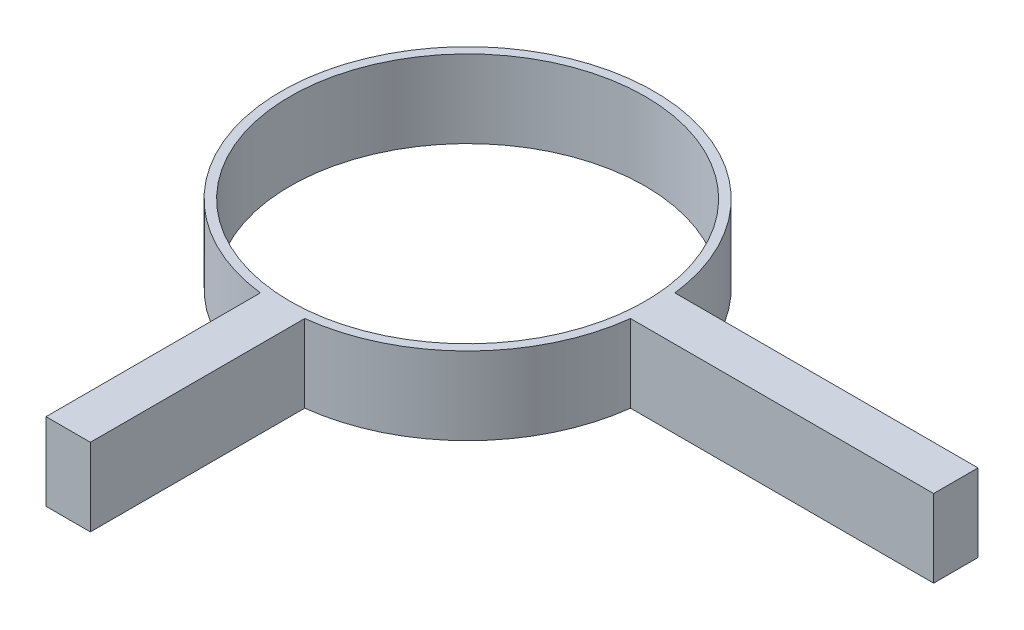
ISO-10303-21;
HEADER;
FILE_DESCRIPTION(('STEP AP214'),'2;1');
FILE_NAME('part.step','',(''),(''),'','','');
FILE_SCHEMA(('AUTOMOTIVE_DESIGN { 1 0 10303 214 1 1 1 1 }'));
ENDSEC;
DATA;
#1=APPLICATION_CONTEXT('core data for automotive mechanical design processes');
#2=APPLICATION_PROTOCOL_DEFINITION('international standard','automotive_design',2000,#1);
#3=PRODUCT_CONTEXT('',#1,'mechanical');
#4=PRODUCT('Part','Part','',(#3));
#5=PRODUCT_RELATED_PRODUCT_CATEGORY('part','',(#4));
#6=PRODUCT_DEFINITION_FORMATION('','',#4);
#7=PRODUCT_DEFINITION_CONTEXT('part definition',#1,'design');
#8=PRODUCT_DEFINITION('design','',#6,#7);
#9=PRODUCT_DEFINITION_SHAPE('','',#8);
#10=(LENGTH_UNIT() NAMED_UNIT(*) SI_UNIT(.MILLI.,.METRE.));
#11=(NAMED_UNIT(*) PLANE_ANGLE_UNIT() SI_UNIT($,.RADIAN.));
#12=(NAMED_UNIT(*) SI_UNIT($,.STERADIAN.) SOLID_ANGLE_UNIT());
#13=UNCERTAINTY_MEASURE_WITH_UNIT(LENGTH_MEASURE(1.E-05),#10,'distance_accuracy_value','');
#14=(GEOMETRIC_REPRESENTATION_CONTEXT(3) GLOBAL_UNCERTAINTY_ASSIGNED_CONTEXT((#13)) GLOBAL_UNIT_ASSIGNED_CONTEXT((#10,
#11,#12)) REPRESENTATION_CONTEXT('',''));
#15=CARTESIAN_POINT('',(0.,0.,0.));
#16=DIRECTION('',(0.,0.,1.));
#17=DIRECTION('',(1.,0.,0.));
#18=AXIS2_PLACEMENT_3D('',#15,#16,#17);
#19=CARTESIAN_POINT('',(0.,7.,0.));
#20=DIRECTION('',(0.,-1.,0.));
#21=DIRECTION('',(0.,0.,-1.));
#22=AXIS2_PLACEMENT_3D('',#19,#20,#21);
#23=CYLINDRICAL_SURFACE('',#22,16.8);
#24=CARTESIAN_POINT('',(0.,0.,0.));
#25=DIRECTION('',(0.,1.,0.));
#26=DIRECTION('',(0.,0.,1.));
#27=AXIS2_PLACEMENT_3D('',#24,#25,#26);
#28=CIRCLE('',#27,16.8);
#29=CARTESIAN_POINT('',(2.,0.,16.6805275695944));
#30=VERTEX_POINT('',#29);
#31=CARTESIAN_POINT('',(16.6805275695944,0.,2.));
#32=VERTEX_POINT('',#31);
#33=EDGE_CURVE('E143',#30,#32,#28,.T.);
#34=ORIENTED_EDGE('',*,*,#33,.T.);
#35=DIRECTION('',(0.,-1.,0.));
#36=VECTOR('',#35,1.);
#37=CARTESIAN_POINT('',(16.6805275695944,7.,2.));
#38=LINE('',#37,#36);
#39=CARTESIAN_POINT('',(16.6805275695944,7.,2.));
#40=VERTEX_POINT('',#39);
#41=EDGE_CURVE('E11',#40,#32,#38,.T.);
#42=ORIENTED_EDGE('',*,*,#41,.F.);
#43=CARTESIAN_POINT('',(0.,7.,0.));
#44=DIRECTION('',(0.,1.,0.));
#45=DIRECTION('',(0.,0.,1.));
#46=AXIS2_PLACEMENT_3D('',#43,#44,#45);
#47=CIRCLE('',#46,16.8);
#48=CARTESIAN_POINT('',(2.,7.,16.6805275695944));
#49=VERTEX_POINT('',#48);
#50=EDGE_CURVE('E100',#49,#40,#47,.T.);
#51=ORIENTED_EDGE('',*,*,#50,.F.);
#52=DIRECTION('',(0.,-1.,0.));
#53=VECTOR('',#52,1.);
#54=CARTESIAN_POINT('',(2.,7.,16.6805275695944));
#55=LINE('',#54,#53);
#56=EDGE_CURVE('E136',#49,#30,#55,.T.);
#57=ORIENTED_EDGE('',*,*,#56,.T.);
#58=EDGE_LOOP('',(#34,#42,#51,#57));
#59=FACE_BOUND('',#58,.T.);
#60=ADVANCED_FACE('F43',(#59),#23,.T.);
#61=CARTESIAN_POINT('',(0.,7.,2.));
#62=DIRECTION('',(0.,0.,1.));
#63=DIRECTION('',(1.,0.,0.));
#64=AXIS2_PLACEMENT_3D('',#61,#62,#63);
#65=PLANE('',#64);
#66=DIRECTION('',(-1.,0.,0.));
#67=VECTOR('',#66,1.);
#68=CARTESIAN_POINT('',(0.,0.,2.));
#69=LINE('',#68,#67);
#70=CARTESIAN_POINT('',(44.,0.,2.));
#71=VERTEX_POINT('',#70);
#72=EDGE_CURVE('E146',#71,#32,#69,.T.);
#73=ORIENTED_EDGE('',*,*,#72,.F.);
#74=DIRECTION('',(0.,-1.,0.));
#75=VECTOR('',#74,1.);
#76=CARTESIAN_POINT('',(44.,7.,2.));
#77=LINE('',#76,#75);
#78=CARTESIAN_POINT('',(44.,7.,2.));
#79=VERTEX_POINT('',#78);
#80=EDGE_CURVE('E52',#79,#71,#77,.T.);
#81=ORIENTED_EDGE('',*,*,#80,.F.);
#82=DIRECTION('',(-1.,0.,0.));
#83=VECTOR('',#82,1.);
#84=CARTESIAN_POINT('',(0.,7.,2.));
#85=LINE('',#84,#83);
#86=EDGE_CURVE('E185',#79,#40,#85,.T.);
#87=ORIENTED_EDGE('',*,*,#86,.T.);
#88=ORIENTED_EDGE('',*,*,#41,.T.);
#89=EDGE_LOOP('',(#73,#81,#87,#88));
#90=FACE_BOUND('',#89,.T.);
#91=ADVANCED_FACE('F175',(#90),#65,.T.);
#92=CARTESIAN_POINT('',(44.,7.,0.));
#93=DIRECTION('',(1.,0.,0.));
#94=DIRECTION('',(0.,0.,-1.));
#95=AXIS2_PLACEMENT_3D('',#92,#93,#94);
#96=PLANE('',#95);
#97=DIRECTION('',(0.,0.,1.));
#98=VECTOR('',#97,1.);
#99=CARTESIAN_POINT('',(44.,0.,0.));
#100=LINE('',#99,#98);
#101=CARTESIAN_POINT('',(44.,0.,-2.));
#102=VERTEX_POINT('',#101);
#103=EDGE_CURVE('E150',#102,#71,#100,.T.);
#104=ORIENTED_EDGE('',*,*,#103,.F.);
#105=DIRECTION('',(0.,-1.,0.));
#106=VECTOR('',#105,1.);
#107=CARTESIAN_POINT('',(44.,7.,-2.));
#108=LINE('',#107,#106);
#109=CARTESIAN_POINT('',(44.,7.,-2.));
#110=VERTEX_POINT('',#109);
#111=EDGE_CURVE('E165',#110,#102,#108,.T.);
#112=ORIENTED_EDGE('',*,*,#111,.F.);
#113=DIRECTION('',(0.,0.,1.));
#114=VECTOR('',#113,1.);
#115=CARTESIAN_POINT('',(44.,7.,0.));
#116=LINE('',#115,#114);
#117=EDGE_CURVE('E172',#110,#79,#116,.T.);
#118=ORIENTED_EDGE('',*,*,#117,.T.);
#119=ORIENTED_EDGE('',*,*,#80,.T.);
#120=EDGE_LOOP('',(#104,#112,#118,#119));
#121=FACE_BOUND('',#120,.T.);
#122=ADVANCED_FACE('F170',(#121),#96,.T.);
#123=CARTESIAN_POINT('',(0.,7.,-2.));
#124=DIRECTION('',(0.,0.,-1.));
#125=DIRECTION('',(-1.,0.,0.));
#126=AXIS2_PLACEMENT_3D('',#123,#124,#125);
#127=PLANE('',#126);
#128=DIRECTION('',(1.,0.,0.));
#129=VECTOR('',#128,1.);
#130=CARTESIAN_POINT('',(0.,0.,-2.));
#131=LINE('',#130,#129);
#132=CARTESIAN_POINT('',(16.6805275695944,0.,-2.));
#133=VERTEX_POINT('',#132);
#134=EDGE_CURVE('E153',#133,#102,#131,.T.);
#135=ORIENTED_EDGE('',*,*,#134,.F.);
#136=DIRECTION('',(0.,-1.,0.));
#137=VECTOR('',#136,1.);
#138=CARTESIAN_POINT('',(16.6805275695944,7.,-2.));
#139=LINE('',#138,#137);
#140=CARTESIAN_POINT('',(16.6805275695944,7.,-2.));
#141=VERTEX_POINT('',#140);
#142=EDGE_CURVE('E163',#141,#133,#139,.T.);
#143=ORIENTED_EDGE('',*,*,#142,.F.);
#144=DIRECTION('',(1.,0.,0.));
#145=VECTOR('',#144,1.);
#146=CARTESIAN_POINT('',(0.,7.,-2.));
#147=LINE('',#146,#145);
#148=EDGE_CURVE('E184',#141,#110,#147,.T.);
#149=ORIENTED_EDGE('',*,*,#148,.T.);
#150=ORIENTED_EDGE('',*,*,#111,.T.);
#151=EDGE_LOOP('',(#135,#143,#149,#150));
#152=FACE_BOUND('',#151,.T.);
#153=ADVANCED_FACE('F182',(#152),#127,.T.);
#154=CARTESIAN_POINT('',(-2.,0.,16.6805275695944));
#155=VERTEX_POINT('',#154);
#156=EDGE_CURVE('E147',#133,#155,#28,.T.);
#157=ORIENTED_EDGE('',*,*,#156,.T.);
#158=DIRECTION('',(0.,-1.,0.));
#159=VECTOR('',#158,1.);
#160=CARTESIAN_POINT('',(-2.,7.,16.6805275695944));
#161=LINE('',#160,#159);
#162=CARTESIAN_POINT('',(-2.,7.,16.6805275695944));
#163=VERTEX_POINT('',#162);
#164=EDGE_CURVE('E131',#163,#155,#161,.T.);
#165=ORIENTED_EDGE('',*,*,#164,.F.);
#166=EDGE_CURVE('E122',#141,#163,#47,.T.);
#167=ORIENTED_EDGE('',*,*,#166,.F.);
#168=ORIENTED_EDGE('',*,*,#142,.T.);
#169=EDGE_LOOP('',(#157,#165,#167,#168));
#170=FACE_BOUND('',#169,.T.);
#171=ADVANCED_FACE('F208',(#170),#23,.T.);
#172=CARTESIAN_POINT('',(-2.,7.,0.));
#173=DIRECTION('',(1.,0.,0.));
#174=DIRECTION('',(0.,0.,-1.));
#175=AXIS2_PLACEMENT_3D('',#172,#173,#174);
#176=PLANE('',#175);
#177=DIRECTION('',(0.,0.,1.));
#178=VECTOR('',#177,1.);
#179=CARTESIAN_POINT('',(-2.,0.,0.));
#180=LINE('',#179,#178);
#181=CARTESIAN_POINT('',(-2.,0.,36.));
#182=VERTEX_POINT('',#181);
#183=EDGE_CURVE('E130',#155,#182,#180,.T.);
#184=ORIENTED_EDGE('',*,*,#183,.T.);
#185=DIRECTION('',(0.,-1.,0.));
#186=VECTOR('',#185,1.);
#187=CARTESIAN_POINT('',(-2.,7.,36.));
#188=LINE('',#187,#186);
#189=CARTESIAN_POINT('',(-2.,7.,36.));
#190=VERTEX_POINT('',#189);
#191=EDGE_CURVE('E127',#190,#182,#188,.T.);
#192=ORIENTED_EDGE('',*,*,#191,.F.);
#193=DIRECTION('',(0.,0.,1.));
#194=VECTOR('',#193,1.);
#195=CARTESIAN_POINT('',(-2.,7.,0.));
#196=LINE('',#195,#194);
#197=EDGE_CURVE('E115',#163,#190,#196,.T.);
#198=ORIENTED_EDGE('',*,*,#197,.F.);
#199=ORIENTED_EDGE('',*,*,#164,.T.);
#200=EDGE_LOOP('',(#184,#192,#198,#199));
#201=FACE_BOUND('',#200,.T.);
#202=ADVANCED_FACE('F128',(#201),#176,.F.);
#203=CARTESIAN_POINT('',(0.,7.,36.));
#204=DIRECTION('',(0.,0.,-1.));
#205=DIRECTION('',(-1.,0.,0.));
#206=AXIS2_PLACEMENT_3D('',#203,#204,#205);
#207=PLANE('',#206);
#208=DIRECTION('',(1.,0.,0.));
#209=VECTOR('',#208,1.);
#210=CARTESIAN_POINT('',(0.,0.,36.));
#211=LINE('',#210,#209);
#212=CARTESIAN_POINT('',(2.,0.,36.));
#213=VERTEX_POINT('',#212);
#214=EDGE_CURVE('E88',#182,#213,#211,.T.);
#215=ORIENTED_EDGE('',*,*,#214,.T.);
#216=DIRECTION('',(0.,-1.,0.));
#217=VECTOR('',#216,1.);
#218=CARTESIAN_POINT('',(2.,7.,36.));
#219=LINE('',#218,#217);
#220=CARTESIAN_POINT('',(2.,7.,36.));
#221=VERTEX_POINT('',#220);
#222=EDGE_CURVE('E132',#221,#213,#219,.T.);
#223=ORIENTED_EDGE('',*,*,#222,.F.);
#224=DIRECTION('',(1.,0.,0.));
#225=VECTOR('',#224,1.);
#226=CARTESIAN_POINT('',(0.,7.,36.));
#227=LINE('',#226,#225);
#228=EDGE_CURVE('E119',#190,#221,#227,.T.);
#229=ORIENTED_EDGE('',*,*,#228,.F.);
#230=ORIENTED_EDGE('',*,*,#191,.T.);
#231=EDGE_LOOP('',(#215,#223,#229,#230));
#232=FACE_BOUND('',#231,.T.);
#233=ADVANCED_FACE('F134',(#232),#207,.F.);
#234=CARTESIAN_POINT('',(0.,7.,0.));
#235=DIRECTION('',(0.,-1.,0.));
#236=DIRECTION('',(0.,0.,-1.));
#237=AXIS2_PLACEMENT_3D('',#234,#235,#236);
#238=CYLINDRICAL_SURFACE('',#237,16.);
#239=CARTESIAN_POINT('',(0.,7.,0.));
#240=DIRECTION('',(0.,1.,0.));
#241=DIRECTION('',(0.,0.,1.));
#242=AXIS2_PLACEMENT_3D('',#239,#240,#241);
#243=CIRCLE('',#242,16.);
#244=CARTESIAN_POINT('',(0.,7.,16.));
#245=VERTEX_POINT('',#244);
#246=EDGE_CURVE('E159',#245,#245,#243,.T.);
#247=ORIENTED_EDGE('',*,*,#246,.T.);
#248=EDGE_LOOP('',(#247));
#249=FACE_BOUND('',#248,.T.);
#250=CARTESIAN_POINT('',(0.,0.,0.));
#251=DIRECTION('',(0.,1.,0.));
#252=DIRECTION('',(0.,0.,1.));
#253=AXIS2_PLACEMENT_3D('',#250,#251,#252);
#254=CIRCLE('',#253,16.);
#255=CARTESIAN_POINT('',(0.,0.,16.));
#256=VERTEX_POINT('',#255);
#257=EDGE_CURVE('E140',#256,#256,#254,.T.);
#258=ORIENTED_EDGE('',*,*,#257,.F.);
#259=EDGE_LOOP('',(#258));
#260=FACE_BOUND('',#259,.T.);
#261=ADVANCED_FACE('F45',(#249,#260),#238,.F.);
#262=CARTESIAN_POINT('',(2.,7.,0.));
#263=DIRECTION('',(-1.,0.,0.));
#264=DIRECTION('',(0.,0.,1.));
#265=AXIS2_PLACEMENT_3D('',#262,#263,#264);
#266=PLANE('',#265);
#267=DIRECTION('',(0.,0.,-1.));
#268=VECTOR('',#267,1.);
#269=CARTESIAN_POINT('',(2.,0.,0.));
#270=LINE('',#269,#268);
#271=EDGE_CURVE('E94',#213,#30,#270,.T.);
#272=ORIENTED_EDGE('',*,*,#271,.T.);
#273=ORIENTED_EDGE('',*,*,#56,.F.);
#274=DIRECTION('',(0.,0.,-1.));
#275=VECTOR('',#274,1.);
#276=CARTESIAN_POINT('',(2.,7.,0.));
#277=LINE('',#276,#275);
#278=EDGE_CURVE('E60',#221,#49,#277,.T.);
#279=ORIENTED_EDGE('',*,*,#278,.F.);
#280=ORIENTED_EDGE('',*,*,#222,.T.);
#281=EDGE_LOOP('',(#272,#273,#279,#280));
#282=FACE_BOUND('',#281,.T.);
#283=ADVANCED_FACE('F196',(#282),#266,.F.);
#284=CARTESIAN_POINT('',(0.,7.,0.));
#285=DIRECTION('',(0.,1.,0.));
#286=DIRECTION('',(0.,0.,1.));
#287=AXIS2_PLACEMENT_3D('',#284,#285,#286);
#288=PLANE('',#287);
#289=ORIENTED_EDGE('',*,*,#246,.F.);
#290=EDGE_LOOP('',(#289));
#291=FACE_BOUND('',#290,.T.);
#292=ORIENTED_EDGE('',*,*,#50,.T.);
#293=ORIENTED_EDGE('',*,*,#86,.F.);
#294=ORIENTED_EDGE('',*,*,#117,.F.);
#295=ORIENTED_EDGE('',*,*,#148,.F.);
#296=ORIENTED_EDGE('',*,*,#166,.T.);
#297=ORIENTED_EDGE('',*,*,#197,.T.);
#298=ORIENTED_EDGE('',*,*,#228,.T.);
#299=ORIENTED_EDGE('',*,*,#278,.T.);
#300=EDGE_LOOP('',(#292,#293,#294,#295,#296,#297,#298,#299));
#301=FACE_BOUND('',#300,.T.);
#302=ADVANCED_FACE('F117',(#291,#301),#288,.T.);
#303=CARTESIAN_POINT('',(0.,0.,0.));
#304=DIRECTION('',(0.,1.,0.));
#305=DIRECTION('',(0.,0.,1.));
#306=AXIS2_PLACEMENT_3D('',#303,#304,#305);
#307=PLANE('',#306);
#308=ORIENTED_EDGE('',*,*,#257,.T.);
#309=EDGE_LOOP('',(#308));
#310=FACE_BOUND('',#309,.T.);
#311=ORIENTED_EDGE('',*,*,#33,.F.);
#312=ORIENTED_EDGE('',*,*,#271,.F.);
#313=ORIENTED_EDGE('',*,*,#214,.F.);
#314=ORIENTED_EDGE('',*,*,#183,.F.);
#315=ORIENTED_EDGE('',*,*,#156,.F.);
#316=ORIENTED_EDGE('',*,*,#134,.T.);
#317=ORIENTED_EDGE('',*,*,#103,.T.);
#318=ORIENTED_EDGE('',*,*,#72,.T.);
#319=EDGE_LOOP('',(#311,#312,#313,#314,#315,#316,#317,#318));
#320=FACE_BOUND('',#319,.T.);
#321=ADVANCED_FACE('F178',(#310,#320),#307,.F.);
#322=CLOSED_SHELL('',(#60,#91,#122,#153,#171,#202,#233,#261,#283,#302,#321));
#323=MANIFOLD_SOLID_BREP('B2',#322);
#324=ADVANCED_BREP_SHAPE_REPRESENTATION('',(#18,#323),#14);
#325=SHAPE_DEFINITION_REPRESENTATION(#9,#324);
ENDSEC;
END-ISO-10303-21;
